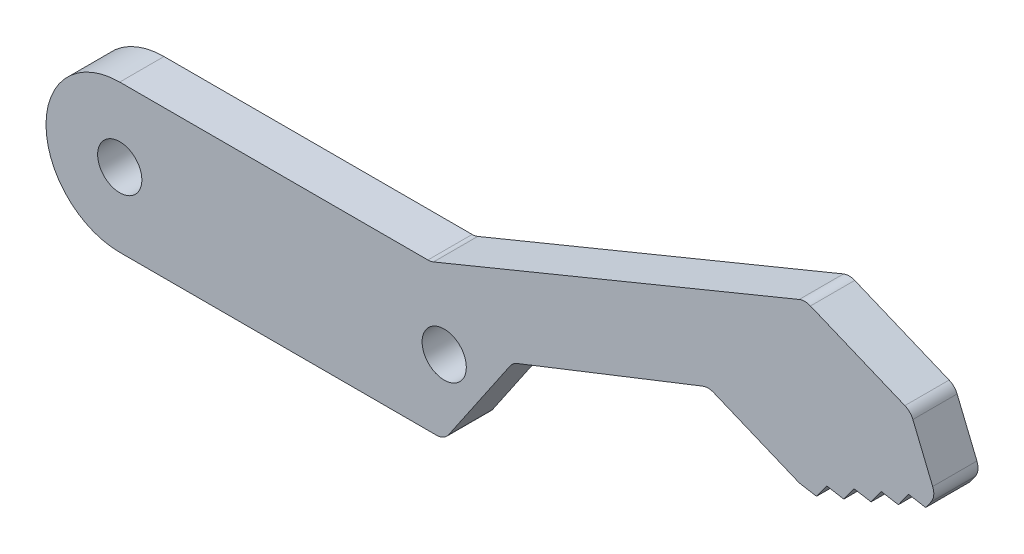
ISO-10303-21;
HEADER;
FILE_DESCRIPTION(('STEP AP214'),'2;1');
FILE_NAME('part.step','',(''),(''),'','','');
FILE_SCHEMA(('AUTOMOTIVE_DESIGN { 1 0 10303 214 1 1 1 1 }'));
ENDSEC;
DATA;
#1=APPLICATION_CONTEXT('core data for automotive mechanical design processes');
#2=APPLICATION_PROTOCOL_DEFINITION('international standard','automotive_design',2000,#1);
#3=PRODUCT_CONTEXT('',#1,'mechanical');
#4=PRODUCT('Part','Part','',(#3));
#5=PRODUCT_RELATED_PRODUCT_CATEGORY('part','',(#4));
#6=PRODUCT_DEFINITION_FORMATION('','',#4);
#7=PRODUCT_DEFINITION_CONTEXT('part definition',#1,'design');
#8=PRODUCT_DEFINITION('design','',#6,#7);
#9=PRODUCT_DEFINITION_SHAPE('','',#8);
#10=(LENGTH_UNIT() NAMED_UNIT(*) SI_UNIT(.MILLI.,.METRE.));
#11=(NAMED_UNIT(*) PLANE_ANGLE_UNIT() SI_UNIT($,.RADIAN.));
#12=(NAMED_UNIT(*) SI_UNIT($,.STERADIAN.) SOLID_ANGLE_UNIT());
#13=UNCERTAINTY_MEASURE_WITH_UNIT(LENGTH_MEASURE(1.E-05),#10,'distance_accuracy_value','');
#14=(GEOMETRIC_REPRESENTATION_CONTEXT(3) GLOBAL_UNCERTAINTY_ASSIGNED_CONTEXT((#13)) GLOBAL_UNIT_ASSIGNED_CONTEXT((#10,
#11,#12)) REPRESENTATION_CONTEXT('',''));
#15=CARTESIAN_POINT('',(0.,0.,0.));
#16=DIRECTION('',(0.,0.,1.));
#17=DIRECTION('',(1.,0.,0.));
#18=AXIS2_PLACEMENT_3D('',#15,#16,#17);
#19=CARTESIAN_POINT('',(0.,5.,3.));
#20=DIRECTION('',(0.,1.,0.));
#21=DIRECTION('',(0.,0.,1.));
#22=AXIS2_PLACEMENT_3D('',#19,#20,#21);
#23=PLANE('',#22);
#24=DIRECTION('',(1.,0.,0.));
#25=VECTOR('',#24,1.);
#26=CARTESIAN_POINT('',(0.,5.,3.));
#27=LINE('',#26,#25);
#28=CARTESIAN_POINT('',(0.,5.,3.));
#29=VERTEX_POINT('',#28);
#30=CARTESIAN_POINT('',(20.8949921029047,5.,3.));
#31=VERTEX_POINT('',#30);
#32=EDGE_CURVE('E220',#29,#31,#27,.T.);
#33=ORIENTED_EDGE('',*,*,#32,.T.);
#34=DIRECTION('',(0.,0.,-1.));
#35=VECTOR('',#34,1.);
#36=CARTESIAN_POINT('',(20.8949921029047,5.,0.));
#37=LINE('',#36,#35);
#38=CARTESIAN_POINT('',(20.8949921029047,5.,0.));
#39=VERTEX_POINT('',#38);
#40=EDGE_CURVE('E421',#31,#39,#37,.T.);
#41=ORIENTED_EDGE('',*,*,#40,.T.);
#42=DIRECTION('',(1.,0.,0.));
#43=VECTOR('',#42,1.);
#44=CARTESIAN_POINT('',(0.,5.,0.));
#45=LINE('',#44,#43);
#46=CARTESIAN_POINT('',(0.,5.,0.));
#47=VERTEX_POINT('',#46);
#48=EDGE_CURVE('E223',#47,#39,#45,.T.);
#49=ORIENTED_EDGE('',*,*,#48,.F.);
#50=DIRECTION('',(0.,0.,-1.));
#51=VECTOR('',#50,1.);
#52=CARTESIAN_POINT('',(0.,5.,3.));
#53=LINE('',#52,#51);
#54=EDGE_CURVE('E216',#29,#47,#53,.T.);
#55=ORIENTED_EDGE('',*,*,#54,.F.);
#56=EDGE_LOOP('',(#33,#41,#49,#55));
#57=FACE_BOUND('',#56,.T.);
#58=ADVANCED_FACE('F36',(#57),#23,.T.);
#59=CARTESIAN_POINT('',(0.,0.,3.));
#60=DIRECTION('',(0.,0.,-1.));
#61=DIRECTION('',(-1.,0.,0.));
#62=AXIS2_PLACEMENT_3D('',#59,#60,#61);
#63=CYLINDRICAL_SURFACE('',#62,5.);
#64=CARTESIAN_POINT('',(0.,0.,0.));
#65=DIRECTION('',(0.,0.,1.));
#66=DIRECTION('',(1.,0.,0.));
#67=AXIS2_PLACEMENT_3D('',#64,#65,#66);
#68=CIRCLE('',#67,5.);
#69=CARTESIAN_POINT('',(0.,-5.,0.));
#70=VERTEX_POINT('',#69);
#71=EDGE_CURVE('E294',#47,#70,#68,.T.);
#72=ORIENTED_EDGE('',*,*,#71,.T.);
#73=DIRECTION('',(0.,0.,-1.));
#74=VECTOR('',#73,1.);
#75=CARTESIAN_POINT('',(0.,-5.,3.));
#76=LINE('',#75,#74);
#77=CARTESIAN_POINT('',(0.,-5.,3.));
#78=VERTEX_POINT('',#77);
#79=EDGE_CURVE('E227',#78,#70,#76,.T.);
#80=ORIENTED_EDGE('',*,*,#79,.F.);
#81=CARTESIAN_POINT('',(0.,0.,3.));
#82=DIRECTION('',(0.,0.,1.));
#83=DIRECTION('',(1.,0.,0.));
#84=AXIS2_PLACEMENT_3D('',#81,#82,#83);
#85=CIRCLE('',#84,5.);
#86=EDGE_CURVE('E230',#29,#78,#85,.T.);
#87=ORIENTED_EDGE('',*,*,#86,.F.);
#88=ORIENTED_EDGE('',*,*,#54,.T.);
#89=EDGE_LOOP('',(#72,#80,#87,#88));
#90=FACE_BOUND('',#89,.T.);
#91=ADVANCED_FACE('F231',(#90),#63,.T.);
#92=CARTESIAN_POINT('',(0.,-5.,3.));
#93=DIRECTION('',(0.,1.,0.));
#94=DIRECTION('',(0.,0.,1.));
#95=AXIS2_PLACEMENT_3D('',#92,#93,#94);
#96=PLANE('',#95);
#97=DIRECTION('',(1.,0.,0.));
#98=VECTOR('',#97,1.);
#99=CARTESIAN_POINT('',(0.,-5.,0.));
#100=LINE('',#99,#98);
#101=CARTESIAN_POINT('',(21.4710317909837,-5.,0.));
#102=VERTEX_POINT('',#101);
#103=EDGE_CURVE('E296',#70,#102,#100,.T.);
#104=ORIENTED_EDGE('',*,*,#103,.T.);
#105=DIRECTION('',(0.,0.,-1.));
#106=VECTOR('',#105,1.);
#107=CARTESIAN_POINT('',(21.4710317909837,-5.,3.));
#108=LINE('',#107,#106);
#109=CARTESIAN_POINT('',(21.4710317909837,-5.,3.));
#110=VERTEX_POINT('',#109);
#111=EDGE_CURVE('E405',#102,#110,#108,.F.);
#112=ORIENTED_EDGE('',*,*,#111,.T.);
#113=DIRECTION('',(1.,0.,0.));
#114=VECTOR('',#113,1.);
#115=CARTESIAN_POINT('',(0.,-5.,3.));
#116=LINE('',#115,#114);
#117=EDGE_CURVE('E235',#78,#110,#116,.T.);
#118=ORIENTED_EDGE('',*,*,#117,.F.);
#119=ORIENTED_EDGE('',*,*,#79,.T.);
#120=EDGE_LOOP('',(#104,#112,#118,#119));
#121=FACE_BOUND('',#120,.T.);
#122=ADVANCED_FACE('F449',(#121),#96,.F.);
#123=CARTESIAN_POINT('',(17.359129749227,-11.817267240586,3.));
#124=DIRECTION('',(0.826637231519672,-0.562735184136813,0.));
#125=DIRECTION('',(0.562735184136813,0.826637231519672,0.));
#126=AXIS2_PLACEMENT_3D('',#123,#124,#125);
#127=PLANE('',#126);
#128=DIRECTION('',(-0.562735184136813,-0.826637231519672,0.));
#129=VECTOR('',#128,1.);
#130=CARTESIAN_POINT('',(17.359129749227,-11.817267240586,3.));
#131=LINE('',#130,#129);
#132=CARTESIAN_POINT('',(26.4784157784554,1.5786276121599,3.));
#133=VERTEX_POINT('',#132);
#134=CARTESIAN_POINT('',(22.2976690225034,-4.56273518413681,3.));
#135=VERTEX_POINT('',#134);
#136=EDGE_CURVE('E248',#133,#135,#131,.T.);
#137=ORIENTED_EDGE('',*,*,#136,.T.);
#138=DIRECTION('',(0.,0.,-1.));
#139=VECTOR('',#138,1.);
#140=CARTESIAN_POINT('',(22.2976690225034,-4.56273518413681,0.));
#141=LINE('',#140,#139);
#142=CARTESIAN_POINT('',(22.2976690225034,-4.56273518413681,0.));
#143=VERTEX_POINT('',#142);
#144=EDGE_CURVE('E402',#135,#143,#141,.T.);
#145=ORIENTED_EDGE('',*,*,#144,.T.);
#146=DIRECTION('',(-0.562735184136813,-0.826637231519672,0.));
#147=VECTOR('',#146,1.);
#148=CARTESIAN_POINT('',(17.359129749227,-11.817267240586,0.));
#149=LINE('',#148,#147);
#150=CARTESIAN_POINT('',(26.4784157784554,1.5786276121599,0.));
#151=VERTEX_POINT('',#150);
#152=EDGE_CURVE('E299',#151,#143,#149,.T.);
#153=ORIENTED_EDGE('',*,*,#152,.F.);
#154=DIRECTION('',(0.,0.,-1.));
#155=VECTOR('',#154,1.);
#156=CARTESIAN_POINT('',(26.4784157784554,1.57862761215989,3.));
#157=LINE('',#156,#155);
#158=EDGE_CURVE('E400',#151,#133,#157,.F.);
#159=ORIENTED_EDGE('',*,*,#158,.T.);
#160=EDGE_LOOP('',(#137,#145,#153,#159));
#161=FACE_BOUND('',#160,.T.);
#162=ADVANCED_FACE('F558',(#161),#127,.T.);
#163=CARTESIAN_POINT('',(2.95764158823658,-7.50469660790749,3.));
#164=DIRECTION('',(0.366658225069006,-0.930355709387139,0.));
#165=DIRECTION('',(0.930355709387139,0.366658225069006,0.));
#166=AXIS2_PLACEMENT_3D('',#163,#164,#165);
#167=PLANE('',#166);
#168=DIRECTION('',(-0.930355709387139,-0.366658225069006,0.));
#169=VECTOR('',#168,1.);
#170=CARTESIAN_POINT('',(2.95764158823658,-7.50469660790749,3.));
#171=LINE('',#170,#169);
#172=CARTESIAN_POINT('',(39.5241557426607,6.90636471148163,3.));
#173=VERTEX_POINT('',#172);
#174=CARTESIAN_POINT('',(26.938394784906,1.94624813741022,3.));
#175=VERTEX_POINT('',#174);
#176=EDGE_CURVE('E251',#173,#175,#171,.T.);
#177=ORIENTED_EDGE('',*,*,#176,.T.);
#178=DIRECTION('',(0.,0.,-1.));
#179=VECTOR('',#178,1.);
#180=CARTESIAN_POINT('',(26.938394784906,1.94624813741022,0.));
#181=LINE('',#180,#179);
#182=CARTESIAN_POINT('',(26.938394784906,1.94624813741022,0.));
#183=VERTEX_POINT('',#182);
#184=EDGE_CURVE('E418',#175,#183,#181,.T.);
#185=ORIENTED_EDGE('',*,*,#184,.T.);
#186=DIRECTION('',(-0.930355709387139,-0.366658225069006,0.));
#187=VECTOR('',#186,1.);
#188=CARTESIAN_POINT('',(2.95764158823658,-7.50469660790749,0.));
#189=LINE('',#188,#187);
#190=CARTESIAN_POINT('',(39.5241557426607,6.90636471148163,0.));
#191=VERTEX_POINT('',#190);
#192=EDGE_CURVE('E302',#191,#183,#189,.T.);
#193=ORIENTED_EDGE('',*,*,#192,.F.);
#194=DIRECTION('',(0.,0.,-1.));
#195=VECTOR('',#194,1.);
#196=CARTESIAN_POINT('',(39.5241557426607,6.90636471148163,3.));
#197=LINE('',#196,#195);
#198=EDGE_CURVE('E416',#191,#173,#197,.F.);
#199=ORIENTED_EDGE('',*,*,#198,.T.);
#200=EDGE_LOOP('',(#177,#185,#193,#199));
#201=FACE_BOUND('',#200,.T.);
#202=ADVANCED_FACE('F484',(#201),#167,.T.);
#203=CARTESIAN_POINT('',(8.33176803482173,20.1242717038176,3.));
#204=DIRECTION('',(-0.382527526616434,-0.923944095376291,0.));
#205=DIRECTION('',(0.923944095376291,-0.382527526616435,0.));
#206=AXIS2_PLACEMENT_3D('',#203,#204,#205);
#207=PLANE('',#206);
#208=DIRECTION('',(-0.923944095376291,0.382527526616435,0.));
#209=VECTOR('',#208,1.);
#210=CARTESIAN_POINT('',(8.33176803482173,20.1242717038176,0.));
#211=LINE('',#210,#209);
#212=CARTESIAN_POINT('',(45.9778971349674,4.53817648071131,0.));
#213=VERTEX_POINT('',#212);
#214=CARTESIAN_POINT('',(40.2733414943461,6.89995309747078,0.));
#215=VERTEX_POINT('',#214);
#216=EDGE_CURVE('E305',#213,#215,#211,.T.);
#217=ORIENTED_EDGE('',*,*,#216,.F.);
#218=DIRECTION('',(0.,0.,-1.));
#219=VECTOR('',#218,1.);
#220=CARTESIAN_POINT('',(45.9778971349674,4.53817648071131,3.));
#221=LINE('',#220,#219);
#222=CARTESIAN_POINT('',(45.9778971349674,4.53817648071131,3.));
#223=VERTEX_POINT('',#222);
#224=EDGE_CURVE('E382',#213,#223,#221,.F.);
#225=ORIENTED_EDGE('',*,*,#224,.T.);
#226=DIRECTION('',(-0.923944095376291,0.382527526616435,0.));
#227=VECTOR('',#226,1.);
#228=CARTESIAN_POINT('',(8.33176803482173,20.1242717038176,3.));
#229=LINE('',#228,#227);
#230=CARTESIAN_POINT('',(40.2733414943461,6.89995309747078,3.));
#231=VERTEX_POINT('',#230);
#232=EDGE_CURVE('E254',#223,#231,#229,.T.);
#233=ORIENTED_EDGE('',*,*,#232,.T.);
#234=DIRECTION('',(0.,0.,-1.));
#235=VECTOR('',#234,1.);
#236=CARTESIAN_POINT('',(40.2733414943461,6.89995309747078,0.));
#237=LINE('',#236,#235);
#238=EDGE_CURVE('E379',#231,#215,#237,.T.);
#239=ORIENTED_EDGE('',*,*,#238,.T.);
#240=EDGE_LOOP('',(#217,#225,#233,#239));
#241=FACE_BOUND('',#240,.T.);
#242=ADVANCED_FACE('F491',(#241),#207,.T.);
#243=CARTESIAN_POINT('',(2.03956322549325,11.9881382048752,3.));
#244=DIRECTION('',(0.167721751487352,0.985834374567054,0.));
#245=DIRECTION('',(-0.985834374567054,0.167721751487352,0.));
#246=AXIS2_PLACEMENT_3D('',#243,#244,#245);
#247=PLANE('',#246);
#248=DIRECTION('',(0.985834374567054,-0.167721751487352,0.));
#249=VECTOR('',#248,1.);
#250=CARTESIAN_POINT('',(2.03956322549325,11.9881382048752,3.));
#251=LINE('',#250,#249);
#252=CARTESIAN_POINT('',(46.1927029100965,4.47628620152054,3.));
#253=VERTEX_POINT('',#252);
#254=CARTESIAN_POINT('',(47.2443622733128,4.29736552790925,3.));
#255=VERTEX_POINT('',#254);
#256=EDGE_CURVE('E257',#253,#255,#251,.T.);
#257=ORIENTED_EDGE('',*,*,#256,.F.);
#258=DIRECTION('',(0.,0.,-1.));
#259=VECTOR('',#258,1.);
#260=CARTESIAN_POINT('',(46.1927029100965,4.47628620152054,0.));
#261=LINE('',#260,#259);
#262=CARTESIAN_POINT('',(46.1927029100965,4.47628620152054,0.));
#263=VERTEX_POINT('',#262);
#264=EDGE_CURVE('E226',#253,#263,#261,.T.);
#265=ORIENTED_EDGE('',*,*,#264,.T.);
#266=DIRECTION('',(0.985834374567054,-0.167721751487352,0.));
#267=VECTOR('',#266,1.);
#268=CARTESIAN_POINT('',(2.03956322549325,11.9881382048752,0.));
#269=LINE('',#268,#267);
#270=CARTESIAN_POINT('',(47.2443622733128,4.29736552790925,0.));
#271=VERTEX_POINT('',#270);
#272=EDGE_CURVE('E308',#263,#271,#269,.T.);
#273=ORIENTED_EDGE('',*,*,#272,.T.);
#274=DIRECTION('',(0.,0.,-1.));
#275=VECTOR('',#274,1.);
#276=CARTESIAN_POINT('',(47.2443622733128,4.29736552790925,3.));
#277=LINE('',#276,#275);
#278=EDGE_CURVE('E363',#255,#271,#277,.T.);
#279=ORIENTED_EDGE('',*,*,#278,.F.);
#280=EDGE_LOOP('',(#257,#265,#273,#279));
#281=FACE_BOUND('',#280,.T.);
#282=ADVANCED_FACE('F497',(#281),#247,.F.);
#283=CARTESIAN_POINT('',(29.1648387350935,-20.9143444878961,3.));
#284=DIRECTION('',(-0.81264720963323,0.582755963225881,0.));
#285=DIRECTION('',(-0.582755963225881,-0.81264720963323,0.));
#286=AXIS2_PLACEMENT_3D('',#283,#284,#285);
#287=PLANE('',#286);
#288=DIRECTION('',(0.582755963225881,0.81264720963323,0.));
#289=VECTOR('',#288,1.);
#290=CARTESIAN_POINT('',(29.1648387350935,-20.9143444878961,0.));
#291=LINE('',#290,#289);
#292=CARTESIAN_POINT('',(47.9315758685211,5.25567783324654,0.));
#293=VERTEX_POINT('',#292);
#294=EDGE_CURVE('E310',#271,#293,#291,.T.);
#295=ORIENTED_EDGE('',*,*,#294,.T.);
#296=DIRECTION('',(0.,0.,-1.));
#297=VECTOR('',#296,1.);
#298=CARTESIAN_POINT('',(47.9315758685211,5.25567783324654,3.));
#299=LINE('',#298,#297);
#300=CARTESIAN_POINT('',(47.9315758685211,5.25567783324654,3.));
#301=VERTEX_POINT('',#300);
#302=EDGE_CURVE('E360',#301,#293,#299,.T.);
#303=ORIENTED_EDGE('',*,*,#302,.F.);
#304=DIRECTION('',(0.582755963225881,0.81264720963323,0.));
#305=VECTOR('',#304,1.);
#306=CARTESIAN_POINT('',(29.1648387350935,-20.9143444878961,3.));
#307=LINE('',#306,#305);
#308=EDGE_CURVE('E259',#255,#301,#307,.T.);
#309=ORIENTED_EDGE('',*,*,#308,.F.);
#310=ORIENTED_EDGE('',*,*,#278,.T.);
#311=EDGE_LOOP('',(#295,#303,#309,#310));
#312=FACE_BOUND('',#311,.T.);
#313=ADVANCED_FACE('F502',(#312),#287,.F.);
#314=CARTESIAN_POINT('',(2.2173479265008,13.0331205519536,3.));
#315=DIRECTION('',(0.167721751487352,0.985834374567054,0.));
#316=DIRECTION('',(-0.985834374567054,0.167721751487352,0.));
#317=AXIS2_PLACEMENT_3D('',#314,#315,#316);
#318=PLANE('',#317);
#319=DIRECTION('',(0.985834374567054,-0.167721751487352,0.));
#320=VECTOR('',#319,1.);
#321=CARTESIAN_POINT('',(2.2173479265008,13.0331205519536,0.));
#322=LINE('',#321,#320);
#323=CARTESIAN_POINT('',(49.0941187296459,5.05789235337565,0.));
#324=VERTEX_POINT('',#323);
#325=EDGE_CURVE('E312',#293,#324,#322,.T.);
#326=ORIENTED_EDGE('',*,*,#325,.T.);
#327=DIRECTION('',(0.,0.,-1.));
#328=VECTOR('',#327,1.);
#329=CARTESIAN_POINT('',(49.0941187296459,5.05789235337565,3.));
#330=LINE('',#329,#328);
#331=CARTESIAN_POINT('',(49.0941187296459,5.05789235337565,3.));
#332=VERTEX_POINT('',#331);
#333=EDGE_CURVE('E357',#332,#324,#330,.T.);
#334=ORIENTED_EDGE('',*,*,#333,.F.);
#335=DIRECTION('',(0.985834374567054,-0.167721751487352,0.));
#336=VECTOR('',#335,1.);
#337=CARTESIAN_POINT('',(2.2173479265008,13.0331205519536,3.));
#338=LINE('',#337,#336);
#339=EDGE_CURVE('E261',#301,#332,#338,.T.);
#340=ORIENTED_EDGE('',*,*,#339,.F.);
#341=ORIENTED_EDGE('',*,*,#302,.T.);
#342=EDGE_LOOP('',(#326,#334,#340,#341));
#343=FACE_BOUND('',#342,.T.);
#344=ADVANCED_FACE('F508',(#343),#318,.F.);
#345=CARTESIAN_POINT('',(30.0262430544978,-21.5320645734766,3.));
#346=DIRECTION('',(-0.81264720963323,0.582755963225881,0.));
#347=DIRECTION('',(-0.582755963225881,-0.812647209633231,0.));
#348=AXIS2_PLACEMENT_3D('',#345,#346,#347);
#349=PLANE('',#348);
#350=DIRECTION('',(0.582755963225881,0.812647209633231,0.));
#351=VECTOR('',#350,1.);
#352=CARTESIAN_POINT('',(30.0262430544978,-21.5320645734766,0.));
#353=LINE('',#352,#351);
#354=CARTESIAN_POINT('',(49.7813323248542,6.01620465871294,0.));
#355=VERTEX_POINT('',#354);
#356=EDGE_CURVE('E314',#324,#355,#353,.T.);
#357=ORIENTED_EDGE('',*,*,#356,.T.);
#358=DIRECTION('',(0.,0.,-1.));
#359=VECTOR('',#358,1.);
#360=CARTESIAN_POINT('',(49.7813323248542,6.01620465871294,3.));
#361=LINE('',#360,#359);
#362=CARTESIAN_POINT('',(49.7813323248542,6.01620465871294,3.));
#363=VERTEX_POINT('',#362);
#364=EDGE_CURVE('E354',#363,#355,#361,.T.);
#365=ORIENTED_EDGE('',*,*,#364,.F.);
#366=DIRECTION('',(0.582755963225881,0.812647209633231,0.));
#367=VECTOR('',#366,1.);
#368=CARTESIAN_POINT('',(30.0262430544978,-21.5320645734766,3.));
#369=LINE('',#368,#367);
#370=EDGE_CURVE('E263',#332,#363,#369,.T.);
#371=ORIENTED_EDGE('',*,*,#370,.F.);
#372=ORIENTED_EDGE('',*,*,#333,.T.);
#373=EDGE_LOOP('',(#357,#365,#371,#372));
#374=FACE_BOUND('',#373,.T.);
#375=ADVANCED_FACE('F512',(#374),#349,.F.);
#376=CARTESIAN_POINT('',(2.39513262750835,14.0781028990321,3.));
#377=DIRECTION('',(0.167721751487352,0.985834374567054,0.));
#378=DIRECTION('',(-0.985834374567054,0.167721751487352,0.));
#379=AXIS2_PLACEMENT_3D('',#376,#377,#378);
#380=PLANE('',#379);
#381=DIRECTION('',(0.985834374567054,-0.167721751487352,0.));
#382=VECTOR('',#381,1.);
#383=CARTESIAN_POINT('',(2.39513262750835,14.0781028990321,0.));
#384=LINE('',#383,#382);
#385=CARTESIAN_POINT('',(50.943875185979,5.81841917884205,0.));
#386=VERTEX_POINT('',#385);
#387=EDGE_CURVE('E316',#355,#386,#384,.T.);
#388=ORIENTED_EDGE('',*,*,#387,.T.);
#389=DIRECTION('',(0.,0.,-1.));
#390=VECTOR('',#389,1.);
#391=CARTESIAN_POINT('',(50.943875185979,5.81841917884205,3.));
#392=LINE('',#391,#390);
#393=CARTESIAN_POINT('',(50.943875185979,5.81841917884205,3.));
#394=VERTEX_POINT('',#393);
#395=EDGE_CURVE('E351',#394,#386,#392,.T.);
#396=ORIENTED_EDGE('',*,*,#395,.F.);
#397=DIRECTION('',(0.985834374567054,-0.167721751487352,0.));
#398=VECTOR('',#397,1.);
#399=CARTESIAN_POINT('',(2.39513262750835,14.0781028990321,3.));
#400=LINE('',#399,#398);
#401=EDGE_CURVE('E265',#363,#394,#400,.T.);
#402=ORIENTED_EDGE('',*,*,#401,.F.);
#403=ORIENTED_EDGE('',*,*,#364,.T.);
#404=EDGE_LOOP('',(#388,#396,#402,#403));
#405=FACE_BOUND('',#404,.T.);
#406=ADVANCED_FACE('F517',(#405),#380,.F.);
#407=CARTESIAN_POINT('',(30.8876473739021,-22.1497846590571,3.));
#408=DIRECTION('',(-0.81264720963323,0.582755963225881,0.));
#409=DIRECTION('',(-0.582755963225881,-0.81264720963323,0.));
#410=AXIS2_PLACEMENT_3D('',#407,#408,#409);
#411=PLANE('',#410);
#412=DIRECTION('',(0.582755963225881,0.81264720963323,0.));
#413=VECTOR('',#412,1.);
#414=CARTESIAN_POINT('',(30.8876473739021,-22.1497846590571,0.));
#415=LINE('',#414,#413);
#416=CARTESIAN_POINT('',(51.6310887811873,6.77673148417933,0.));
#417=VERTEX_POINT('',#416);
#418=EDGE_CURVE('E318',#386,#417,#415,.T.);
#419=ORIENTED_EDGE('',*,*,#418,.T.);
#420=DIRECTION('',(0.,0.,-1.));
#421=VECTOR('',#420,1.);
#422=CARTESIAN_POINT('',(51.6310887811873,6.77673148417933,3.));
#423=LINE('',#422,#421);
#424=CARTESIAN_POINT('',(51.6310887811873,6.77673148417933,3.));
#425=VERTEX_POINT('',#424);
#426=EDGE_CURVE('E348',#425,#417,#423,.T.);
#427=ORIENTED_EDGE('',*,*,#426,.F.);
#428=DIRECTION('',(0.582755963225881,0.81264720963323,0.));
#429=VECTOR('',#428,1.);
#430=CARTESIAN_POINT('',(30.8876473739021,-22.1497846590571,3.));
#431=LINE('',#430,#429);
#432=EDGE_CURVE('E267',#394,#425,#431,.T.);
#433=ORIENTED_EDGE('',*,*,#432,.F.);
#434=ORIENTED_EDGE('',*,*,#395,.T.);
#435=EDGE_LOOP('',(#419,#427,#433,#434));
#436=FACE_BOUND('',#435,.T.);
#437=ADVANCED_FACE('F523',(#436),#411,.F.);
#438=CARTESIAN_POINT('',(2.57291732851589,15.1230852461106,3.));
#439=DIRECTION('',(0.167721751487352,0.985834374567054,0.));
#440=DIRECTION('',(-0.985834374567054,0.167721751487352,0.));
#441=AXIS2_PLACEMENT_3D('',#438,#439,#440);
#442=PLANE('',#441);
#443=DIRECTION('',(0.985834374567054,-0.167721751487352,0.));
#444=VECTOR('',#443,1.);
#445=CARTESIAN_POINT('',(2.57291732851589,15.1230852461106,0.));
#446=LINE('',#445,#444);
#447=CARTESIAN_POINT('',(52.7936316423121,6.57894600430845,0.));
#448=VERTEX_POINT('',#447);
#449=EDGE_CURVE('E320',#417,#448,#446,.T.);
#450=ORIENTED_EDGE('',*,*,#449,.T.);
#451=DIRECTION('',(0.,0.,-1.));
#452=VECTOR('',#451,1.);
#453=CARTESIAN_POINT('',(52.7936316423121,6.57894600430845,3.));
#454=LINE('',#453,#452);
#455=CARTESIAN_POINT('',(52.7936316423121,6.57894600430845,3.));
#456=VERTEX_POINT('',#455);
#457=EDGE_CURVE('E345',#456,#448,#454,.T.);
#458=ORIENTED_EDGE('',*,*,#457,.F.);
#459=DIRECTION('',(0.985834374567054,-0.167721751487352,0.));
#460=VECTOR('',#459,1.);
#461=CARTESIAN_POINT('',(2.57291732851589,15.1230852461106,3.));
#462=LINE('',#461,#460);
#463=EDGE_CURVE('E269',#425,#456,#462,.T.);
#464=ORIENTED_EDGE('',*,*,#463,.F.);
#465=ORIENTED_EDGE('',*,*,#426,.T.);
#466=EDGE_LOOP('',(#450,#458,#464,#465));
#467=FACE_BOUND('',#466,.T.);
#468=ADVANCED_FACE('F527',(#467),#442,.F.);
#469=CARTESIAN_POINT('',(31.7490516933065,-22.7675047446376,3.));
#470=DIRECTION('',(-0.812647209633231,0.58275596322588,0.));
#471=DIRECTION('',(-0.58275596322588,-0.812647209633231,0.));
#472=AXIS2_PLACEMENT_3D('',#469,#470,#471);
#473=PLANE('',#472);
#474=DIRECTION('',(0.58275596322588,0.812647209633231,0.));
#475=VECTOR('',#474,1.);
#476=CARTESIAN_POINT('',(31.7490516933065,-22.7675047446376,0.));
#477=LINE('',#476,#475);
#478=CARTESIAN_POINT('',(53.4808452375204,7.53725830964573,0.));
#479=VERTEX_POINT('',#478);
#480=EDGE_CURVE('E322',#448,#479,#477,.T.);
#481=ORIENTED_EDGE('',*,*,#480,.T.);
#482=DIRECTION('',(0.,0.,-1.));
#483=VECTOR('',#482,1.);
#484=CARTESIAN_POINT('',(53.4808452375204,7.53725830964573,3.));
#485=LINE('',#484,#483);
#486=CARTESIAN_POINT('',(53.4808452375204,7.53725830964573,3.));
#487=VERTEX_POINT('',#486);
#488=EDGE_CURVE('E342',#487,#479,#485,.T.);
#489=ORIENTED_EDGE('',*,*,#488,.F.);
#490=DIRECTION('',(0.58275596322588,0.812647209633231,0.));
#491=VECTOR('',#490,1.);
#492=CARTESIAN_POINT('',(31.7490516933065,-22.7675047446376,3.));
#493=LINE('',#492,#491);
#494=EDGE_CURVE('E271',#456,#487,#493,.T.);
#495=ORIENTED_EDGE('',*,*,#494,.F.);
#496=ORIENTED_EDGE('',*,*,#457,.T.);
#497=EDGE_LOOP('',(#481,#489,#495,#496));
#498=FACE_BOUND('',#497,.T.);
#499=ADVANCED_FACE('F532',(#498),#473,.F.);
#500=CARTESIAN_POINT('',(2.75070202952348,16.1680675931891,3.));
#501=DIRECTION('',(0.167721751487354,0.985834374567054,0.));
#502=DIRECTION('',(-0.985834374567054,0.167721751487354,0.));
#503=AXIS2_PLACEMENT_3D('',#500,#501,#502);
#504=PLANE('',#503);
#505=DIRECTION('',(0.985834374567054,-0.167721751487354,0.));
#506=VECTOR('',#505,1.);
#507=CARTESIAN_POINT('',(2.75070202952348,16.1680675931891,0.));
#508=LINE('',#507,#506);
#509=CARTESIAN_POINT('',(54.6433880986452,7.33947282977484,0.));
#510=VERTEX_POINT('',#509);
#511=EDGE_CURVE('E324',#479,#510,#508,.T.);
#512=ORIENTED_EDGE('',*,*,#511,.T.);
#513=DIRECTION('',(0.,0.,-1.));
#514=VECTOR('',#513,1.);
#515=CARTESIAN_POINT('',(54.6433880986452,7.33947282977484,3.));
#516=LINE('',#515,#514);
#517=CARTESIAN_POINT('',(54.6433880986452,7.33947282977484,3.));
#518=VERTEX_POINT('',#517);
#519=EDGE_CURVE('E292',#518,#510,#516,.T.);
#520=ORIENTED_EDGE('',*,*,#519,.F.);
#521=DIRECTION('',(0.985834374567054,-0.167721751487354,0.));
#522=VECTOR('',#521,1.);
#523=CARTESIAN_POINT('',(2.75070202952348,16.1680675931891,3.));
#524=LINE('',#523,#522);
#525=EDGE_CURVE('E273',#487,#518,#524,.T.);
#526=ORIENTED_EDGE('',*,*,#525,.F.);
#527=ORIENTED_EDGE('',*,*,#488,.T.);
#528=EDGE_LOOP('',(#512,#520,#526,#527));
#529=FACE_BOUND('',#528,.T.);
#530=ADVANCED_FACE('F538',(#529),#504,.F.);
#531=CARTESIAN_POINT('',(32.6104560127107,-23.3852248302181,3.));
#532=DIRECTION('',(-0.81264720963323,0.582755963225881,0.));
#533=DIRECTION('',(-0.582755963225881,-0.81264720963323,0.));
#534=AXIS2_PLACEMENT_3D('',#531,#532,#533);
#535=PLANE('',#534);
#536=DIRECTION('',(0.582755963225881,0.81264720963323,0.));
#537=VECTOR('',#536,1.);
#538=CARTESIAN_POINT('',(32.6104560127107,-23.3852248302181,0.));
#539=LINE('',#538,#537);
#540=CARTESIAN_POINT('',(55.0076105756614,7.84737733579562,0.));
#541=VERTEX_POINT('',#540);
#542=EDGE_CURVE('E326',#510,#541,#539,.T.);
#543=ORIENTED_EDGE('',*,*,#542,.T.);
#544=DIRECTION('',(0.,0.,-1.));
#545=VECTOR('',#544,1.);
#546=CARTESIAN_POINT('',(55.0076105756614,7.84737733579563,3.));
#547=LINE('',#546,#545);
#548=CARTESIAN_POINT('',(55.0076105756614,7.84737733579562,3.));
#549=VERTEX_POINT('',#548);
#550=EDGE_CURVE('E398',#541,#549,#547,.F.);
#551=ORIENTED_EDGE('',*,*,#550,.T.);
#552=DIRECTION('',(0.582755963225881,0.81264720963323,0.));
#553=VECTOR('',#552,1.);
#554=CARTESIAN_POINT('',(32.6104560127107,-23.3852248302181,3.));
#555=LINE('',#554,#553);
#556=EDGE_CURVE('E275',#518,#549,#555,.T.);
#557=ORIENTED_EDGE('',*,*,#556,.F.);
#558=ORIENTED_EDGE('',*,*,#519,.T.);
#559=EDGE_LOOP('',(#543,#551,#557,#558));
#560=FACE_BOUND('',#559,.T.);
#561=ADVANCED_FACE('F542',(#560),#535,.F.);
#562=CARTESIAN_POINT('',(50.2480911880094,20.6594879807686,3.));
#563=DIRECTION('',(0.924878228166552,0.380263412733199,0.));
#564=DIRECTION('',(-0.380263412733199,0.924878228166552,0.));
#565=AXIS2_PLACEMENT_3D('',#562,#563,#564);
#566=PLANE('',#565);
#567=DIRECTION('',(0.380263412733199,-0.924878228166552,0.));
#568=VECTOR('',#567,1.);
#569=CARTESIAN_POINT('',(50.2480911880094,20.6594879807686,3.));
#570=LINE('',#569,#568);
#571=CARTESIAN_POINT('',(53.777547713185,12.0751293806799,3.));
#572=VERTEX_POINT('',#571);
#573=CARTESIAN_POINT('',(55.1198415941947,8.8103967117547,3.));
#574=VERTEX_POINT('',#573);
#575=EDGE_CURVE('E278',#572,#574,#570,.T.);
#576=ORIENTED_EDGE('',*,*,#575,.T.);
#577=DIRECTION('',(0.,0.,-1.));
#578=VECTOR('',#577,1.);
#579=CARTESIAN_POINT('',(55.1198415941947,8.81039671175471,0.));
#580=LINE('',#579,#578);
#581=CARTESIAN_POINT('',(55.1198415941947,8.8103967117547,0.));
#582=VERTEX_POINT('',#581);
#583=EDGE_CURVE('E395',#574,#582,#580,.T.);
#584=ORIENTED_EDGE('',*,*,#583,.T.);
#585=DIRECTION('',(0.380263412733199,-0.924878228166552,0.));
#586=VECTOR('',#585,1.);
#587=CARTESIAN_POINT('',(50.2480911880094,20.6594879807686,0.));
#588=LINE('',#587,#586);
#589=CARTESIAN_POINT('',(53.777547713185,12.0751293806799,0.));
#590=VERTEX_POINT('',#589);
#591=EDGE_CURVE('E329',#590,#582,#588,.T.);
#592=ORIENTED_EDGE('',*,*,#591,.F.);
#593=DIRECTION('',(0.,0.,-1.));
#594=VECTOR('',#593,1.);
#595=CARTESIAN_POINT('',(53.777547713185,12.0751293806799,3.));
#596=LINE('',#595,#594);
#597=EDGE_CURVE('E393',#590,#572,#596,.F.);
#598=ORIENTED_EDGE('',*,*,#597,.T.);
#599=EDGE_LOOP('',(#576,#584,#592,#598));
#600=FACE_BOUND('',#599,.T.);
#601=ADVANCED_FACE('F548',(#600),#566,.T.);
#602=CARTESIAN_POINT('',(12.2496802435377,29.5874648064558,3.));
#603=DIRECTION('',(0.382527526616433,0.923944095376292,0.));
#604=DIRECTION('',(-0.923944095376292,0.382527526616433,0.));
#605=AXIS2_PLACEMENT_3D('',#602,#603,#604);
#606=PLANE('',#605);
#607=DIRECTION('',(0.923944095376292,-0.382527526616433,0.));
#608=VECTOR('',#607,1.);
#609=CARTESIAN_POINT('',(12.2496802435377,29.5874648064558,3.));
#610=LINE('',#609,#608);
#611=CARTESIAN_POINT('',(46.83396435864,15.2690220256054,3.));
#612=VERTEX_POINT('',#611);
#613=CARTESIAN_POINT('',(53.2351970116349,12.618810063323,3.));
#614=VERTEX_POINT('',#613);
#615=EDGE_CURVE('E281',#612,#614,#610,.T.);
#616=ORIENTED_EDGE('',*,*,#615,.T.);
#617=DIRECTION('',(0.,0.,-1.));
#618=VECTOR('',#617,1.);
#619=CARTESIAN_POINT('',(53.2351970116349,12.618810063323,3.));
#620=LINE('',#619,#618);
#621=CARTESIAN_POINT('',(53.2351970116349,12.618810063323,0.));
#622=VERTEX_POINT('',#621);
#623=EDGE_CURVE('E409',#614,#622,#620,.T.);
#624=ORIENTED_EDGE('',*,*,#623,.T.);
#625=DIRECTION('',(0.923944095376292,-0.382527526616433,0.));
#626=VECTOR('',#625,1.);
#627=CARTESIAN_POINT('',(12.2496802435377,29.5874648064558,0.));
#628=LINE('',#627,#626);
#629=CARTESIAN_POINT('',(46.83396435864,15.2690220256054,0.));
#630=VERTEX_POINT('',#629);
#631=EDGE_CURVE('E332',#630,#622,#628,.T.);
#632=ORIENTED_EDGE('',*,*,#631,.F.);
#633=DIRECTION('',(0.,0.,-1.));
#634=VECTOR('',#633,1.);
#635=CARTESIAN_POINT('',(46.83396435864,15.2690220256054,3.));
#636=LINE('',#635,#634);
#637=EDGE_CURVE('E407',#630,#612,#636,.F.);
#638=ORIENTED_EDGE('',*,*,#637,.T.);
#639=EDGE_LOOP('',(#616,#624,#632,#638));
#640=FACE_BOUND('',#639,.T.);
#641=ADVANCED_FACE('F553',(#640),#606,.T.);
#642=CARTESIAN_POINT('',(22.,0.,3.));
#643=DIRECTION('',(0.,0.,-1.));
#644=DIRECTION('',(-1.,0.,0.));
#645=AXIS2_PLACEMENT_3D('',#642,#643,#644);
#646=CYLINDRICAL_SURFACE('',#645,1.5);
#647=CARTESIAN_POINT('',(22.,0.,3.));
#648=DIRECTION('',(0.,0.,1.));
#649=DIRECTION('',(1.,0.,0.));
#650=AXIS2_PLACEMENT_3D('',#647,#648,#649);
#651=CIRCLE('',#650,1.5);
#652=CARTESIAN_POINT('',(23.5,0.,3.));
#653=VERTEX_POINT('',#652);
#654=EDGE_CURVE('E286',#653,#653,#651,.T.);
#655=ORIENTED_EDGE('',*,*,#654,.T.);
#656=EDGE_LOOP('',(#655));
#657=FACE_BOUND('',#656,.T.);
#658=CARTESIAN_POINT('',(22.,0.,0.));
#659=DIRECTION('',(0.,0.,1.));
#660=DIRECTION('',(1.,0.,0.));
#661=AXIS2_PLACEMENT_3D('',#658,#659,#660);
#662=CIRCLE('',#661,1.5);
#663=CARTESIAN_POINT('',(23.5,0.,0.));
#664=VERTEX_POINT('',#663);
#665=EDGE_CURVE('E244',#664,#664,#662,.T.);
#666=ORIENTED_EDGE('',*,*,#665,.F.);
#667=EDGE_LOOP('',(#666));
#668=FACE_BOUND('',#667,.T.);
#669=ADVANCED_FACE('F598',(#657,#668),#646,.F.);
#670=CARTESIAN_POINT('',(1.29150065909148,-3.1411931867727,3.));
#671=DIRECTION('',(-0.380263412733199,0.924878228166552,0.));
#672=DIRECTION('',(-0.924878228166552,-0.380263412733199,0.));
#673=AXIS2_PLACEMENT_3D('',#670,#671,#672);
#674=PLANE('',#673);
#675=DIRECTION('',(0.924878228166552,0.380263412733199,0.));
#676=VECTOR('',#675,1.);
#677=CARTESIAN_POINT('',(1.29150065909148,-3.1411931867727,3.));
#678=LINE('',#677,#676);
#679=CARTESIAN_POINT('',(21.2752555156379,5.07512177183345,3.));
#680=VERTEX_POINT('',#679);
#681=CARTESIAN_POINT('',(46.0711734192903,15.2699561583957,3.));
#682=VERTEX_POINT('',#681);
#683=EDGE_CURVE('E284',#680,#682,#678,.T.);
#684=ORIENTED_EDGE('',*,*,#683,.T.);
#685=DIRECTION('',(0.,0.,-1.));
#686=VECTOR('',#685,1.);
#687=CARTESIAN_POINT('',(46.0711734192903,15.2699561583957,3.));
#688=LINE('',#687,#686);
#689=CARTESIAN_POINT('',(46.0711734192903,15.2699561583957,0.));
#690=VERTEX_POINT('',#689);
#691=EDGE_CURVE('E413',#682,#690,#688,.T.);
#692=ORIENTED_EDGE('',*,*,#691,.T.);
#693=DIRECTION('',(0.924878228166552,0.380263412733199,0.));
#694=VECTOR('',#693,1.);
#695=CARTESIAN_POINT('',(1.29150065909148,-3.1411931867727,0.));
#696=LINE('',#695,#694);
#697=CARTESIAN_POINT('',(21.2752555156379,5.07512177183345,0.));
#698=VERTEX_POINT('',#697);
#699=EDGE_CURVE('E335',#698,#690,#696,.T.);
#700=ORIENTED_EDGE('',*,*,#699,.F.);
#701=DIRECTION('',(0.,0.,-1.));
#702=VECTOR('',#701,1.);
#703=CARTESIAN_POINT('',(21.2752555156379,5.07512177183345,3.));
#704=LINE('',#703,#702);
#705=EDGE_CURVE('E58',#698,#680,#704,.F.);
#706=ORIENTED_EDGE('',*,*,#705,.T.);
#707=EDGE_LOOP('',(#684,#692,#700,#706));
#708=FACE_BOUND('',#707,.T.);
#709=ADVANCED_FACE('F435',(#708),#674,.T.);
#710=CARTESIAN_POINT('',(0.,0.,3.));
#711=DIRECTION('',(0.,0.,-1.));
#712=DIRECTION('',(-1.,0.,0.));
#713=AXIS2_PLACEMENT_3D('',#710,#711,#712);
#714=CYLINDRICAL_SURFACE('',#713,1.5);
#715=CARTESIAN_POINT('',(0.,0.,3.));
#716=DIRECTION('',(0.,0.,1.));
#717=DIRECTION('',(1.,0.,0.));
#718=AXIS2_PLACEMENT_3D('',#715,#716,#717);
#719=CIRCLE('',#718,1.5);
#720=CARTESIAN_POINT('',(1.5,0.,3.));
#721=VERTEX_POINT('',#720);
#722=EDGE_CURVE('E289',#721,#721,#719,.T.);
#723=ORIENTED_EDGE('',*,*,#722,.T.);
#724=EDGE_LOOP('',(#723));
#725=FACE_BOUND('',#724,.T.);
#726=CARTESIAN_POINT('',(0.,0.,0.));
#727=DIRECTION('',(0.,0.,1.));
#728=DIRECTION('',(1.,0.,0.));
#729=AXIS2_PLACEMENT_3D('',#726,#727,#728);
#730=CIRCLE('',#729,1.5);
#731=CARTESIAN_POINT('',(1.5,0.,0.));
#732=VERTEX_POINT('',#731);
#733=EDGE_CURVE('E241',#732,#732,#730,.T.);
#734=ORIENTED_EDGE('',*,*,#733,.F.);
#735=EDGE_LOOP('',(#734));
#736=FACE_BOUND('',#735,.T.);
#737=ADVANCED_FACE('F601',(#725,#736),#714,.F.);
#738=CARTESIAN_POINT('',(0.,0.,3.));
#739=DIRECTION('',(0.,0.,1.));
#740=DIRECTION('',(1.,0.,0.));
#741=AXIS2_PLACEMENT_3D('',#738,#739,#740);
#742=PLANE('',#741);
#743=ORIENTED_EDGE('',*,*,#232,.F.);
#744=CARTESIAN_POINT('',(46.3604246615839,5.4621205760876,3.));
#745=DIRECTION('',(0.,0.,1.));
#746=DIRECTION('',(1.,0.,0.));
#747=AXIS2_PLACEMENT_3D('',#744,#745,#746);
#748=CIRCLE('',#747,1.);
#749=EDGE_CURVE('E391',#223,#253,#748,.T.);
#750=ORIENTED_EDGE('',*,*,#749,.T.);
#751=ORIENTED_EDGE('',*,*,#256,.T.);
#752=ORIENTED_EDGE('',*,*,#308,.T.);
#753=ORIENTED_EDGE('',*,*,#339,.T.);
#754=ORIENTED_EDGE('',*,*,#370,.T.);
#755=ORIENTED_EDGE('',*,*,#401,.T.);
#756=ORIENTED_EDGE('',*,*,#432,.T.);
#757=ORIENTED_EDGE('',*,*,#463,.T.);
#758=ORIENTED_EDGE('',*,*,#494,.T.);
#759=ORIENTED_EDGE('',*,*,#525,.T.);
#760=ORIENTED_EDGE('',*,*,#556,.T.);
#761=CARTESIAN_POINT('',(54.1949633660282,8.43013329902151,3.));
#762=DIRECTION('',(0.,0.,1.));
#763=DIRECTION('',(1.,0.,0.));
#764=AXIS2_PLACEMENT_3D('',#761,#762,#763);
#765=CIRCLE('',#764,1.);
#766=EDGE_CURVE('E389',#549,#574,#765,.T.);
#767=ORIENTED_EDGE('',*,*,#766,.T.);
#768=ORIENTED_EDGE('',*,*,#575,.F.);
#769=CARTESIAN_POINT('',(52.8526694850185,11.6948659679467,3.));
#770=DIRECTION('',(0.,0.,1.));
#771=DIRECTION('',(1.,0.,0.));
#772=AXIS2_PLACEMENT_3D('',#769,#770,#771);
#773=CIRCLE('',#772,1.);
#774=EDGE_CURVE('E385',#572,#614,#773,.T.);
#775=ORIENTED_EDGE('',*,*,#774,.T.);
#776=ORIENTED_EDGE('',*,*,#615,.F.);
#777=CARTESIAN_POINT('',(46.4514368320236,14.3450779302291,3.));
#778=DIRECTION('',(0.,0.,1.));
#779=DIRECTION('',(1.,0.,0.));
#780=AXIS2_PLACEMENT_3D('',#777,#778,#779);
#781=CIRCLE('',#780,1.);
#782=EDGE_CURVE('E51',#612,#682,#781,.T.);
#783=ORIENTED_EDGE('',*,*,#782,.T.);
#784=ORIENTED_EDGE('',*,*,#683,.F.);
#785=CARTESIAN_POINT('',(20.8949921029047,6.,3.));
#786=DIRECTION('',(0.,0.,1.));
#787=DIRECTION('',(1.,0.,0.));
#788=AXIS2_PLACEMENT_3D('',#785,#786,#787);
#789=CIRCLE('',#788,1.);
#790=EDGE_CURVE('E11',#680,#31,#789,.F.);
#791=ORIENTED_EDGE('',*,*,#790,.T.);
#792=ORIENTED_EDGE('',*,*,#32,.F.);
#793=ORIENTED_EDGE('',*,*,#86,.T.);
#794=ORIENTED_EDGE('',*,*,#117,.T.);
#795=CARTESIAN_POINT('',(21.4710317909837,-4.,3.));
#796=DIRECTION('',(0.,0.,1.));
#797=DIRECTION('',(1.,0.,0.));
#798=AXIS2_PLACEMENT_3D('',#795,#796,#797);
#799=CIRCLE('',#798,1.);
#800=EDGE_CURVE('E387',#110,#135,#799,.T.);
#801=ORIENTED_EDGE('',*,*,#800,.T.);
#802=ORIENTED_EDGE('',*,*,#136,.F.);
#803=CARTESIAN_POINT('',(27.305053009975,1.01589242802308,3.));
#804=DIRECTION('',(0.,0.,1.));
#805=DIRECTION('',(1.,0.,0.));
#806=AXIS2_PLACEMENT_3D('',#803,#804,#805);
#807=CIRCLE('',#806,1.);
#808=EDGE_CURVE('E425',#133,#175,#807,.F.);
#809=ORIENTED_EDGE('',*,*,#808,.T.);
#810=ORIENTED_EDGE('',*,*,#176,.F.);
#811=CARTESIAN_POINT('',(39.8908139677297,5.97600900209449,3.));
#812=DIRECTION('',(0.,0.,1.));
#813=DIRECTION('',(1.,0.,0.));
#814=AXIS2_PLACEMENT_3D('',#811,#812,#813);
#815=CIRCLE('',#814,1.);
#816=EDGE_CURVE('E429',#173,#231,#815,.F.);
#817=ORIENTED_EDGE('',*,*,#816,.T.);
#818=EDGE_LOOP('',(#743,#750,#751,#752,#753,#754,#755,#756,#757,#758,#759,#760,#767,#768,#775,
#776,#783,#784,#791,#792,#793,#794,#801,#802,#809,#810,#817));
#819=FACE_BOUND('',#818,.T.);
#820=ORIENTED_EDGE('',*,*,#654,.F.);
#821=EDGE_LOOP('',(#820));
#822=FACE_BOUND('',#821,.T.);
#823=ORIENTED_EDGE('',*,*,#722,.F.);
#824=EDGE_LOOP('',(#823));
#825=FACE_BOUND('',#824,.T.);
#826=ADVANCED_FACE('F238',(#819,#822,#825),#742,.T.);
#827=CARTESIAN_POINT('',(0.,0.,0.));
#828=DIRECTION('',(0.,0.,1.));
#829=DIRECTION('',(1.,0.,0.));
#830=AXIS2_PLACEMENT_3D('',#827,#828,#829);
#831=PLANE('',#830);
#832=ORIENTED_EDGE('',*,*,#272,.F.);
#833=CARTESIAN_POINT('',(46.3604246615839,5.4621205760876,0.));
#834=DIRECTION('',(0.,0.,1.));
#835=DIRECTION('',(1.,0.,0.));
#836=AXIS2_PLACEMENT_3D('',#833,#834,#835);
#837=CIRCLE('',#836,1.);
#838=EDGE_CURVE('E377',#263,#213,#837,.F.);
#839=ORIENTED_EDGE('',*,*,#838,.T.);
#840=ORIENTED_EDGE('',*,*,#216,.T.);
#841=CARTESIAN_POINT('',(39.8908139677297,5.97600900209449,0.));
#842=DIRECTION('',(0.,0.,1.));
#843=DIRECTION('',(1.,0.,0.));
#844=AXIS2_PLACEMENT_3D('',#841,#842,#843);
#845=CIRCLE('',#844,1.);
#846=EDGE_CURVE('E427',#215,#191,#845,.T.);
#847=ORIENTED_EDGE('',*,*,#846,.T.);
#848=ORIENTED_EDGE('',*,*,#192,.T.);
#849=CARTESIAN_POINT('',(27.305053009975,1.01589242802308,0.));
#850=DIRECTION('',(0.,0.,1.));
#851=DIRECTION('',(1.,0.,0.));
#852=AXIS2_PLACEMENT_3D('',#849,#850,#851);
#853=CIRCLE('',#852,1.);
#854=EDGE_CURVE('E423',#183,#151,#853,.T.);
#855=ORIENTED_EDGE('',*,*,#854,.T.);
#856=ORIENTED_EDGE('',*,*,#152,.T.);
#857=CARTESIAN_POINT('',(21.4710317909837,-4.,0.));
#858=DIRECTION('',(0.,0.,1.));
#859=DIRECTION('',(1.,0.,0.));
#860=AXIS2_PLACEMENT_3D('',#857,#858,#859);
#861=CIRCLE('',#860,1.);
#862=EDGE_CURVE('E373',#143,#102,#861,.F.);
#863=ORIENTED_EDGE('',*,*,#862,.T.);
#864=ORIENTED_EDGE('',*,*,#103,.F.);
#865=ORIENTED_EDGE('',*,*,#71,.F.);
#866=ORIENTED_EDGE('',*,*,#48,.T.);
#867=CARTESIAN_POINT('',(20.8949921029047,6.,0.));
#868=DIRECTION('',(0.,0.,1.));
#869=DIRECTION('',(1.,0.,0.));
#870=AXIS2_PLACEMENT_3D('',#867,#868,#869);
#871=CIRCLE('',#870,1.);
#872=EDGE_CURVE('E44',#39,#698,#871,.T.);
#873=ORIENTED_EDGE('',*,*,#872,.T.);
#874=ORIENTED_EDGE('',*,*,#699,.T.);
#875=CARTESIAN_POINT('',(46.4514368320236,14.3450779302291,0.));
#876=DIRECTION('',(0.,0.,1.));
#877=DIRECTION('',(1.,0.,0.));
#878=AXIS2_PLACEMENT_3D('',#875,#876,#877);
#879=CIRCLE('',#878,1.);
#880=EDGE_CURVE('E369',#690,#630,#879,.F.);
#881=ORIENTED_EDGE('',*,*,#880,.T.);
#882=ORIENTED_EDGE('',*,*,#631,.T.);
#883=CARTESIAN_POINT('',(52.8526694850185,11.6948659679467,0.));
#884=DIRECTION('',(0.,0.,1.));
#885=DIRECTION('',(1.,0.,0.));
#886=AXIS2_PLACEMENT_3D('',#883,#884,#885);
#887=CIRCLE('',#886,1.);
#888=EDGE_CURVE('E371',#622,#590,#887,.F.);
#889=ORIENTED_EDGE('',*,*,#888,.T.);
#890=ORIENTED_EDGE('',*,*,#591,.T.);
#891=CARTESIAN_POINT('',(54.1949633660282,8.43013329902151,0.));
#892=DIRECTION('',(0.,0.,1.));
#893=DIRECTION('',(1.,0.,0.));
#894=AXIS2_PLACEMENT_3D('',#891,#892,#893);
#895=CIRCLE('',#894,1.);
#896=EDGE_CURVE('E375',#582,#541,#895,.F.);
#897=ORIENTED_EDGE('',*,*,#896,.T.);
#898=ORIENTED_EDGE('',*,*,#542,.F.);
#899=ORIENTED_EDGE('',*,*,#511,.F.);
#900=ORIENTED_EDGE('',*,*,#480,.F.);
#901=ORIENTED_EDGE('',*,*,#449,.F.);
#902=ORIENTED_EDGE('',*,*,#418,.F.);
#903=ORIENTED_EDGE('',*,*,#387,.F.);
#904=ORIENTED_EDGE('',*,*,#356,.F.);
#905=ORIENTED_EDGE('',*,*,#325,.F.);
#906=ORIENTED_EDGE('',*,*,#294,.F.);
#907=EDGE_LOOP('',(#832,#839,#840,#847,#848,#855,#856,#863,#864,#865,#866,#873,#874,#881,#882,
#889,#890,#897,#898,#899,#900,#901,#902,#903,#904,#905,#906));
#908=FACE_BOUND('',#907,.T.);
#909=ORIENTED_EDGE('',*,*,#665,.T.);
#910=EDGE_LOOP('',(#909));
#911=FACE_BOUND('',#910,.T.);
#912=ORIENTED_EDGE('',*,*,#733,.T.);
#913=EDGE_LOOP('',(#912));
#914=FACE_BOUND('',#913,.T.);
#915=ADVANCED_FACE('F432',(#908,#911,#914),#831,.F.);
#916=CARTESIAN_POINT('',(46.3604246615839,5.4621205760876,3.));
#917=DIRECTION('',(0.,0.,1.));
#918=DIRECTION('',(1.,0.,0.));
#919=AXIS2_PLACEMENT_3D('',#916,#917,#918);
#920=CYLINDRICAL_SURFACE('',#919,1.);
#921=ORIENTED_EDGE('',*,*,#749,.F.);
#922=ORIENTED_EDGE('',*,*,#224,.F.);
#923=ORIENTED_EDGE('',*,*,#838,.F.);
#924=ORIENTED_EDGE('',*,*,#264,.F.);
#925=EDGE_LOOP('',(#921,#922,#923,#924));
#926=FACE_BOUND('',#925,.T.);
#927=ADVANCED_FACE('F453',(#926),#920,.T.);
#928=CARTESIAN_POINT('',(54.1949633660282,8.43013329902151,3.));
#929=DIRECTION('',(0.,0.,1.));
#930=DIRECTION('',(1.,0.,0.));
#931=AXIS2_PLACEMENT_3D('',#928,#929,#930);
#932=CYLINDRICAL_SURFACE('',#931,1.);
#933=ORIENTED_EDGE('',*,*,#766,.F.);
#934=ORIENTED_EDGE('',*,*,#550,.F.);
#935=ORIENTED_EDGE('',*,*,#896,.F.);
#936=ORIENTED_EDGE('',*,*,#583,.F.);
#937=EDGE_LOOP('',(#933,#934,#935,#936));
#938=FACE_BOUND('',#937,.T.);
#939=ADVANCED_FACE('F456',(#938),#932,.T.);
#940=CARTESIAN_POINT('',(21.4710317909837,-4.,3.));
#941=DIRECTION('',(0.,0.,1.));
#942=DIRECTION('',(1.,0.,0.));
#943=AXIS2_PLACEMENT_3D('',#940,#941,#942);
#944=CYLINDRICAL_SURFACE('',#943,1.);
#945=ORIENTED_EDGE('',*,*,#800,.F.);
#946=ORIENTED_EDGE('',*,*,#111,.F.);
#947=ORIENTED_EDGE('',*,*,#862,.F.);
#948=ORIENTED_EDGE('',*,*,#144,.F.);
#949=EDGE_LOOP('',(#945,#946,#947,#948));
#950=FACE_BOUND('',#949,.T.);
#951=ADVANCED_FACE('F460',(#950),#944,.T.);
#952=CARTESIAN_POINT('',(52.8526694850185,11.6948659679467,3.));
#953=DIRECTION('',(0.,0.,-1.));
#954=DIRECTION('',(-1.,0.,0.));
#955=AXIS2_PLACEMENT_3D('',#952,#953,#954);
#956=CYLINDRICAL_SURFACE('',#955,1.);
#957=ORIENTED_EDGE('',*,*,#774,.F.);
#958=ORIENTED_EDGE('',*,*,#597,.F.);
#959=ORIENTED_EDGE('',*,*,#888,.F.);
#960=ORIENTED_EDGE('',*,*,#623,.F.);
#961=EDGE_LOOP('',(#957,#958,#959,#960));
#962=FACE_BOUND('',#961,.T.);
#963=ADVANCED_FACE('F464',(#962),#956,.T.);
#964=CARTESIAN_POINT('',(46.4514368320236,14.3450779302291,3.));
#965=DIRECTION('',(0.,0.,-1.));
#966=DIRECTION('',(-1.,0.,0.));
#967=AXIS2_PLACEMENT_3D('',#964,#965,#966);
#968=CYLINDRICAL_SURFACE('',#967,1.);
#969=ORIENTED_EDGE('',*,*,#782,.F.);
#970=ORIENTED_EDGE('',*,*,#637,.F.);
#971=ORIENTED_EDGE('',*,*,#880,.F.);
#972=ORIENTED_EDGE('',*,*,#691,.F.);
#973=EDGE_LOOP('',(#969,#970,#971,#972));
#974=FACE_BOUND('',#973,.T.);
#975=ADVANCED_FACE('F468',(#974),#968,.T.);
#976=CARTESIAN_POINT('',(27.305053009975,1.01589242802308,3.));
#977=DIRECTION('',(0.,0.,1.));
#978=DIRECTION('',(1.,0.,0.));
#979=AXIS2_PLACEMENT_3D('',#976,#977,#978);
#980=CYLINDRICAL_SURFACE('',#979,1.);
#981=ORIENTED_EDGE('',*,*,#808,.F.);
#982=ORIENTED_EDGE('',*,*,#158,.F.);
#983=ORIENTED_EDGE('',*,*,#854,.F.);
#984=ORIENTED_EDGE('',*,*,#184,.F.);
#985=EDGE_LOOP('',(#981,#982,#983,#984));
#986=FACE_BOUND('',#985,.T.);
#987=ADVANCED_FACE('F442',(#986),#980,.F.);
#988=CARTESIAN_POINT('',(39.8908139677297,5.97600900209449,3.));
#989=DIRECTION('',(0.,0.,1.));
#990=DIRECTION('',(1.,0.,0.));
#991=AXIS2_PLACEMENT_3D('',#988,#989,#990);
#992=CYLINDRICAL_SURFACE('',#991,1.);
#993=ORIENTED_EDGE('',*,*,#816,.F.);
#994=ORIENTED_EDGE('',*,*,#198,.F.);
#995=ORIENTED_EDGE('',*,*,#846,.F.);
#996=ORIENTED_EDGE('',*,*,#238,.F.);
#997=EDGE_LOOP('',(#993,#994,#995,#996));
#998=FACE_BOUND('',#997,.T.);
#999=ADVANCED_FACE('F438',(#998),#992,.F.);
#1000=CARTESIAN_POINT('',(20.8949921029047,6.,3.));
#1001=DIRECTION('',(0.,0.,1.));
#1002=DIRECTION('',(1.,0.,0.));
#1003=AXIS2_PLACEMENT_3D('',#1000,#1001,#1002);
#1004=CYLINDRICAL_SURFACE('',#1003,1.);
#1005=ORIENTED_EDGE('',*,*,#790,.F.);
#1006=ORIENTED_EDGE('',*,*,#705,.F.);
#1007=ORIENTED_EDGE('',*,*,#872,.F.);
#1008=ORIENTED_EDGE('',*,*,#40,.F.);
#1009=EDGE_LOOP('',(#1005,#1006,#1007,#1008));
#1010=FACE_BOUND('',#1009,.T.);
#1011=ADVANCED_FACE('F38',(#1010),#1004,.F.);
#1012=CLOSED_SHELL('',(#58,#91,#122,#162,#202,#242,#282,#313,#344,#375,#406,#437,#468,#499,#530,
#561,#601,#641,#669,#709,#737,#826,#915,#927,#939,#951,#963,#975,#987,#999,#1011));
#1013=MANIFOLD_SOLID_BREP('B2',#1012);
#1014=ADVANCED_BREP_SHAPE_REPRESENTATION('',(#18,#1013),#14);
#1015=SHAPE_DEFINITION_REPRESENTATION(#9,#1014);
ENDSEC;
END-ISO-10303-21;
